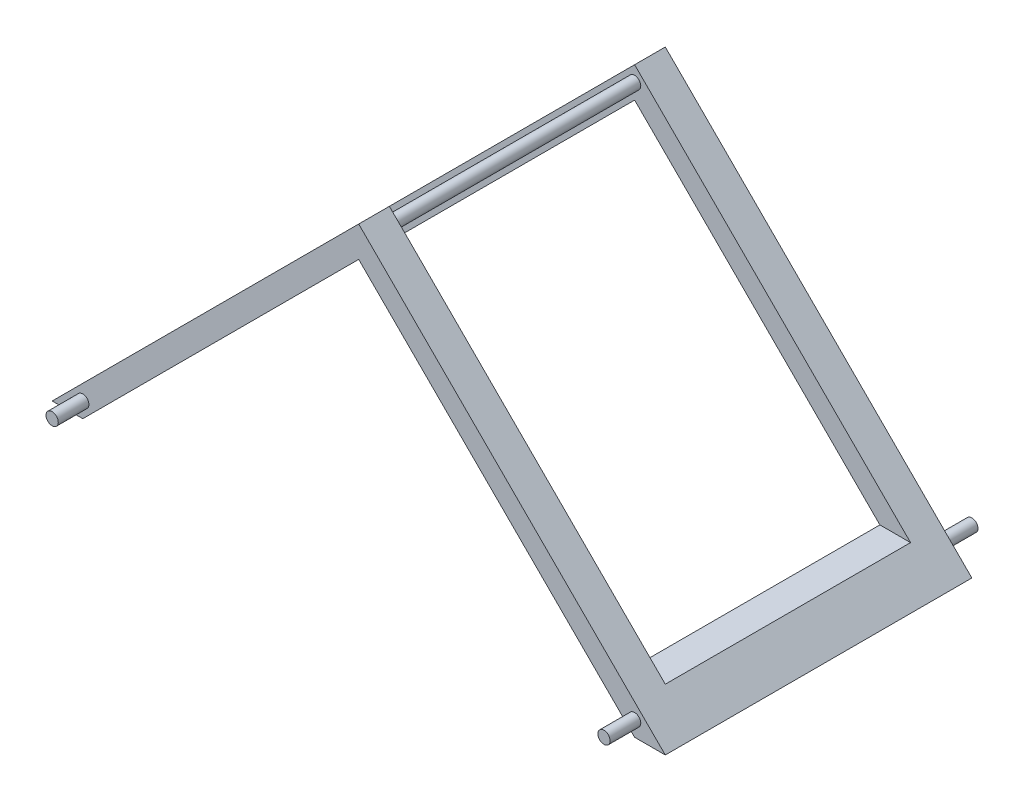
ISO-10303-21;
HEADER;
FILE_DESCRIPTION(('STEP AP214'),'2;1');
FILE_NAME('part.step','',(''),(''),'','','');
FILE_SCHEMA(('AUTOMOTIVE_DESIGN { 1 0 10303 214 1 1 1 1 }'));
ENDSEC;
DATA;
#1=APPLICATION_CONTEXT('core data for automotive mechanical design processes');
#2=APPLICATION_PROTOCOL_DEFINITION('international standard','automotive_design',2000,#1);
#3=PRODUCT_CONTEXT('',#1,'mechanical');
#4=PRODUCT('Part','Part','',(#3));
#5=PRODUCT_RELATED_PRODUCT_CATEGORY('part','',(#4));
#6=PRODUCT_DEFINITION_FORMATION('','',#4);
#7=PRODUCT_DEFINITION_CONTEXT('part definition',#1,'design');
#8=PRODUCT_DEFINITION('design','',#6,#7);
#9=PRODUCT_DEFINITION_SHAPE('','',#8);
#10=(LENGTH_UNIT() NAMED_UNIT(*) SI_UNIT(.MILLI.,.METRE.));
#11=(NAMED_UNIT(*) PLANE_ANGLE_UNIT() SI_UNIT($,.RADIAN.));
#12=(NAMED_UNIT(*) SI_UNIT($,.STERADIAN.) SOLID_ANGLE_UNIT());
#13=UNCERTAINTY_MEASURE_WITH_UNIT(LENGTH_MEASURE(1.E-05),#10,'distance_accuracy_value','');
#14=(GEOMETRIC_REPRESENTATION_CONTEXT(3) GLOBAL_UNCERTAINTY_ASSIGNED_CONTEXT((#13)) GLOBAL_UNIT_ASSIGNED_CONTEXT((#10,
#11,#12)) REPRESENTATION_CONTEXT('',''));
#15=CARTESIAN_POINT('',(0.,0.,0.));
#16=DIRECTION('',(0.,0.,1.));
#17=DIRECTION('',(1.,0.,0.));
#18=AXIS2_PLACEMENT_3D('',#15,#16,#17);
#19=CARTESIAN_POINT('',(-450.,0.,250.));
#20=DIRECTION('',(0.,-1.,0.));
#21=DIRECTION('',(1.,0.,0.));
#22=AXIS2_PLACEMENT_3D('',#19,#20,#21);
#23=PLANE('',#22);
#24=DIRECTION('',(-1.,0.,0.));
#25=VECTOR('',#24,1.);
#26=CARTESIAN_POINT('',(-450.,0.,-250.));
#27=LINE('',#26,#25);
#28=CARTESIAN_POINT('',(-450.,0.,-250.));
#29=VERTEX_POINT('',#28);
#30=CARTESIAN_POINT('',(-500.,0.,-250.));
#31=VERTEX_POINT('',#30);
#32=EDGE_CURVE('E169',#29,#31,#27,.T.);
#33=ORIENTED_EDGE('',*,*,#32,.F.);
#34=DIRECTION('',(0.,0.,-1.));
#35=VECTOR('',#34,1.);
#36=CARTESIAN_POINT('',(-450.,0.,250.));
#37=LINE('',#36,#35);
#38=CARTESIAN_POINT('',(-450.,0.,250.));
#39=VERTEX_POINT('',#38);
#40=EDGE_CURVE('E218',#39,#29,#37,.T.);
#41=ORIENTED_EDGE('',*,*,#40,.F.);
#42=DIRECTION('',(-1.,0.,0.));
#43=VECTOR('',#42,1.);
#44=CARTESIAN_POINT('',(-450.,0.,250.));
#45=LINE('',#44,#43);
#46=CARTESIAN_POINT('',(-500.,0.,250.));
#47=VERTEX_POINT('',#46);
#48=EDGE_CURVE('E170',#39,#47,#45,.T.);
#49=ORIENTED_EDGE('',*,*,#48,.T.);
#50=DIRECTION('',(0.,0.,-1.));
#51=VECTOR('',#50,1.);
#52=CARTESIAN_POINT('',(-500.,0.,250.));
#53=LINE('',#52,#51);
#54=EDGE_CURVE('E195',#47,#31,#53,.T.);
#55=ORIENTED_EDGE('',*,*,#54,.T.);
#56=EDGE_LOOP('',(#33,#41,#49,#55));
#57=FACE_BOUND('',#56,.T.);
#58=ADVANCED_FACE('F43',(#57),#23,.T.);
#59=CARTESIAN_POINT('',(0.,450.,250.));
#60=DIRECTION('',(0.707106781186548,-0.707106781186548,0.));
#61=DIRECTION('',(0.707106781186548,0.707106781186548,0.));
#62=AXIS2_PLACEMENT_3D('',#59,#60,#61);
#63=PLANE('',#62);
#64=DIRECTION('',(0.707106781186548,0.707106781186548,0.));
#65=VECTOR('',#64,1.);
#66=CARTESIAN_POINT('',(0.,450.,-200.));
#67=LINE('',#66,#65);
#68=CARTESIAN_POINT('',(-400.,50.0000000000001,-200.));
#69=VERTEX_POINT('',#68);
#70=CARTESIAN_POINT('',(0.,450.,-200.));
#71=VERTEX_POINT('',#70);
#72=EDGE_CURVE('E153',#69,#71,#67,.T.);
#73=ORIENTED_EDGE('',*,*,#72,.F.);
#74=DIRECTION('',(0.,0.,-1.));
#75=VECTOR('',#74,1.);
#76=CARTESIAN_POINT('',(-400.,50.,250.));
#77=LINE('',#76,#75);
#78=CARTESIAN_POINT('',(-400.,50.,200.));
#79=VERTEX_POINT('',#78);
#80=EDGE_CURVE('E142',#79,#69,#77,.T.);
#81=ORIENTED_EDGE('',*,*,#80,.F.);
#82=DIRECTION('',(-0.707106781186548,-0.707106781186548,0.));
#83=VECTOR('',#82,1.);
#84=CARTESIAN_POINT('',(0.,450.,200.));
#85=LINE('',#84,#83);
#86=CARTESIAN_POINT('',(0.,450.,200.));
#87=VERTEX_POINT('',#86);
#88=EDGE_CURVE('E129',#87,#79,#85,.T.);
#89=ORIENTED_EDGE('',*,*,#88,.F.);
#90=DIRECTION('',(0.,0.,-1.));
#91=VECTOR('',#90,1.);
#92=CARTESIAN_POINT('',(0.,450.,250.));
#93=LINE('',#92,#91);
#94=CARTESIAN_POINT('',(0.,450.,250.));
#95=VERTEX_POINT('',#94);
#96=EDGE_CURVE('E222',#95,#87,#93,.T.);
#97=ORIENTED_EDGE('',*,*,#96,.F.);
#98=DIRECTION('',(-0.707106781186548,-0.707106781186548,0.));
#99=VECTOR('',#98,1.);
#100=CARTESIAN_POINT('',(0.,450.,250.));
#101=LINE('',#100,#99);
#102=EDGE_CURVE('E191',#95,#39,#101,.T.);
#103=ORIENTED_EDGE('',*,*,#102,.T.);
#104=ORIENTED_EDGE('',*,*,#40,.T.);
#105=DIRECTION('',(-0.707106781186548,-0.707106781186548,0.));
#106=VECTOR('',#105,1.);
#107=CARTESIAN_POINT('',(0.,450.,-250.));
#108=LINE('',#107,#106);
#109=CARTESIAN_POINT('',(0.,450.,-250.));
#110=VERTEX_POINT('',#109);
#111=EDGE_CURVE('E175',#110,#29,#108,.T.);
#112=ORIENTED_EDGE('',*,*,#111,.F.);
#113=EDGE_CURVE('E225',#71,#110,#93,.T.);
#114=ORIENTED_EDGE('',*,*,#113,.F.);
#115=EDGE_LOOP('',(#73,#81,#89,#97,#103,#104,#112,#114));
#116=FACE_BOUND('',#115,.T.);
#117=ADVANCED_FACE('F151',(#116),#63,.T.);
#118=CARTESIAN_POINT('',(450.,0.,250.));
#119=DIRECTION('',(-0.707106781186548,-0.707106781186547,0.));
#120=DIRECTION('',(0.707106781186547,-0.707106781186548,0.));
#121=AXIS2_PLACEMENT_3D('',#118,#119,#120);
#122=PLANE('',#121);
#123=DIRECTION('',(0.707106781186547,-0.707106781186548,0.));
#124=VECTOR('',#123,1.);
#125=CARTESIAN_POINT('',(450.,0.,-200.));
#126=LINE('',#125,#124);
#127=CARTESIAN_POINT('',(400.,50.0000000000001,-200.));
#128=VERTEX_POINT('',#127);
#129=EDGE_CURVE('E160',#71,#128,#126,.T.);
#130=ORIENTED_EDGE('',*,*,#129,.F.);
#131=ORIENTED_EDGE('',*,*,#113,.T.);
#132=DIRECTION('',(-0.707106781186547,0.707106781186548,0.));
#133=VECTOR('',#132,1.);
#134=CARTESIAN_POINT('',(450.,0.,-250.));
#135=LINE('',#134,#133);
#136=CARTESIAN_POINT('',(450.,0.,-250.));
#137=VERTEX_POINT('',#136);
#138=EDGE_CURVE('E211',#137,#110,#135,.T.);
#139=ORIENTED_EDGE('',*,*,#138,.F.);
#140=DIRECTION('',(0.,0.,-1.));
#141=VECTOR('',#140,1.);
#142=CARTESIAN_POINT('',(450.,0.,250.));
#143=LINE('',#142,#141);
#144=CARTESIAN_POINT('',(450.,0.,250.));
#145=VERTEX_POINT('',#144);
#146=EDGE_CURVE('E226',#145,#137,#143,.T.);
#147=ORIENTED_EDGE('',*,*,#146,.F.);
#148=DIRECTION('',(-0.707106781186547,0.707106781186548,0.));
#149=VECTOR('',#148,1.);
#150=CARTESIAN_POINT('',(450.,0.,250.));
#151=LINE('',#150,#149);
#152=EDGE_CURVE('E187',#145,#95,#151,.T.);
#153=ORIENTED_EDGE('',*,*,#152,.T.);
#154=ORIENTED_EDGE('',*,*,#96,.T.);
#155=DIRECTION('',(-0.707106781186547,0.707106781186548,0.));
#156=VECTOR('',#155,1.);
#157=CARTESIAN_POINT('',(450.,0.,200.));
#158=LINE('',#157,#156);
#159=CARTESIAN_POINT('',(400.,50.0000000000001,200.));
#160=VERTEX_POINT('',#159);
#161=EDGE_CURVE('E132',#160,#87,#158,.T.);
#162=ORIENTED_EDGE('',*,*,#161,.F.);
#163=DIRECTION('',(0.,0.,1.));
#164=VECTOR('',#163,1.);
#165=CARTESIAN_POINT('',(400.,50.0000000000001,250.));
#166=LINE('',#165,#164);
#167=EDGE_CURVE('E156',#128,#160,#166,.T.);
#168=ORIENTED_EDGE('',*,*,#167,.F.);
#169=EDGE_LOOP('',(#130,#131,#139,#147,#153,#154,#162,#168));
#170=FACE_BOUND('',#169,.T.);
#171=ADVANCED_FACE('F276',(#170),#122,.T.);
#172=CARTESIAN_POINT('',(500.,0.,250.));
#173=DIRECTION('',(0.,-1.,0.));
#174=DIRECTION('',(1.,0.,0.));
#175=AXIS2_PLACEMENT_3D('',#172,#173,#174);
#176=PLANE('',#175);
#177=DIRECTION('',(-1.,0.,0.));
#178=VECTOR('',#177,1.);
#179=CARTESIAN_POINT('',(500.,0.,-250.));
#180=LINE('',#179,#178);
#181=CARTESIAN_POINT('',(500.,0.,-250.));
#182=VERTEX_POINT('',#181);
#183=EDGE_CURVE('E207',#182,#137,#180,.T.);
#184=ORIENTED_EDGE('',*,*,#183,.F.);
#185=DIRECTION('',(0.,0.,-1.));
#186=VECTOR('',#185,1.);
#187=CARTESIAN_POINT('',(500.,0.,250.));
#188=LINE('',#187,#186);
#189=CARTESIAN_POINT('',(500.,0.,250.));
#190=VERTEX_POINT('',#189);
#191=EDGE_CURVE('E229',#190,#182,#188,.T.);
#192=ORIENTED_EDGE('',*,*,#191,.F.);
#193=DIRECTION('',(-1.,0.,0.));
#194=VECTOR('',#193,1.);
#195=CARTESIAN_POINT('',(500.,0.,250.));
#196=LINE('',#195,#194);
#197=EDGE_CURVE('E183',#190,#145,#196,.T.);
#198=ORIENTED_EDGE('',*,*,#197,.T.);
#199=ORIENTED_EDGE('',*,*,#146,.T.);
#200=EDGE_LOOP('',(#184,#192,#198,#199));
#201=FACE_BOUND('',#200,.T.);
#202=ADVANCED_FACE('F281',(#201),#176,.T.);
#203=CARTESIAN_POINT('',(0.,500.,250.));
#204=DIRECTION('',(0.707106781186548,0.707106781186548,0.));
#205=DIRECTION('',(-0.707106781186548,0.707106781186548,0.));
#206=AXIS2_PLACEMENT_3D('',#203,#204,#205);
#207=PLANE('',#206);
#208=DIRECTION('',(-0.707106781186548,0.707106781186548,0.));
#209=VECTOR('',#208,1.);
#210=CARTESIAN_POINT('',(0.,500.,-200.));
#211=LINE('',#210,#209);
#212=CARTESIAN_POINT('',(450.,50.0000000000001,-200.));
#213=VERTEX_POINT('',#212);
#214=CARTESIAN_POINT('',(1.66533453693773E-13,500.,-200.));
#215=VERTEX_POINT('',#214);
#216=EDGE_CURVE('E155',#213,#215,#211,.T.);
#217=ORIENTED_EDGE('',*,*,#216,.F.);
#218=DIRECTION('',(0.,0.,-1.));
#219=VECTOR('',#218,1.);
#220=CARTESIAN_POINT('',(450.,50.0000000000001,250.));
#221=LINE('',#220,#219);
#222=CARTESIAN_POINT('',(450.,50.0000000000001,200.));
#223=VERTEX_POINT('',#222);
#224=EDGE_CURVE('E137',#223,#213,#221,.T.);
#225=ORIENTED_EDGE('',*,*,#224,.F.);
#226=DIRECTION('',(0.707106781186548,-0.707106781186548,0.));
#227=VECTOR('',#226,1.);
#228=CARTESIAN_POINT('',(0.,500.,200.));
#229=LINE('',#228,#227);
#230=CARTESIAN_POINT('',(1.66533453693773E-13,500.,200.));
#231=VERTEX_POINT('',#230);
#232=EDGE_CURVE('E305',#231,#223,#229,.T.);
#233=ORIENTED_EDGE('',*,*,#232,.F.);
#234=DIRECTION('',(0.,0.,-1.));
#235=VECTOR('',#234,1.);
#236=CARTESIAN_POINT('',(0.,500.,250.));
#237=LINE('',#236,#235);
#238=CARTESIAN_POINT('',(0.,500.,250.));
#239=VERTEX_POINT('',#238);
#240=EDGE_CURVE('E232',#239,#231,#237,.T.);
#241=ORIENTED_EDGE('',*,*,#240,.F.);
#242=DIRECTION('',(0.707106781186547,-0.707106781186547,0.));
#243=VECTOR('',#242,1.);
#244=CARTESIAN_POINT('',(0.,500.,250.));
#245=LINE('',#244,#243);
#246=EDGE_CURVE('E179',#239,#190,#245,.T.);
#247=ORIENTED_EDGE('',*,*,#246,.T.);
#248=ORIENTED_EDGE('',*,*,#191,.T.);
#249=DIRECTION('',(0.707106781186547,-0.707106781186547,0.));
#250=VECTOR('',#249,1.);
#251=CARTESIAN_POINT('',(0.,500.,-250.));
#252=LINE('',#251,#250);
#253=CARTESIAN_POINT('',(0.,500.,-250.));
#254=VERTEX_POINT('',#253);
#255=EDGE_CURVE('E203',#254,#182,#252,.T.);
#256=ORIENTED_EDGE('',*,*,#255,.F.);
#257=EDGE_CURVE('E236',#215,#254,#237,.T.);
#258=ORIENTED_EDGE('',*,*,#257,.F.);
#259=EDGE_LOOP('',(#217,#225,#233,#241,#247,#248,#256,#258));
#260=FACE_BOUND('',#259,.T.);
#261=ADVANCED_FACE('F285',(#260),#207,.T.);
#262=CARTESIAN_POINT('',(-500.,0.,250.));
#263=DIRECTION('',(-0.707106781186547,0.707106781186548,0.));
#264=DIRECTION('',(-0.707106781186548,-0.707106781186547,0.));
#265=AXIS2_PLACEMENT_3D('',#262,#263,#264);
#266=PLANE('',#265);
#267=DIRECTION('',(-0.707106781186548,-0.707106781186547,0.));
#268=VECTOR('',#267,1.);
#269=CARTESIAN_POINT('',(-500.,0.,-200.));
#270=LINE('',#269,#268);
#271=CARTESIAN_POINT('',(-450.,50.0000000000001,-200.));
#272=VERTEX_POINT('',#271);
#273=EDGE_CURVE('E243',#215,#272,#270,.T.);
#274=ORIENTED_EDGE('',*,*,#273,.F.);
#275=ORIENTED_EDGE('',*,*,#257,.T.);
#276=DIRECTION('',(0.707106781186548,0.707106781186547,0.));
#277=VECTOR('',#276,1.);
#278=CARTESIAN_POINT('',(-500.,0.,-250.));
#279=LINE('',#278,#277);
#280=EDGE_CURVE('E199',#31,#254,#279,.T.);
#281=ORIENTED_EDGE('',*,*,#280,.F.);
#282=ORIENTED_EDGE('',*,*,#54,.F.);
#283=DIRECTION('',(0.707106781186548,0.707106781186547,0.));
#284=VECTOR('',#283,1.);
#285=CARTESIAN_POINT('',(-500.,0.,250.));
#286=LINE('',#285,#284);
#287=EDGE_CURVE('E174',#47,#239,#286,.T.);
#288=ORIENTED_EDGE('',*,*,#287,.T.);
#289=ORIENTED_EDGE('',*,*,#240,.T.);
#290=DIRECTION('',(0.707106781186548,0.707106781186547,0.));
#291=VECTOR('',#290,1.);
#292=CARTESIAN_POINT('',(-500.,0.,200.));
#293=LINE('',#292,#291);
#294=CARTESIAN_POINT('',(-450.,50.0000000000001,200.));
#295=VERTEX_POINT('',#294);
#296=EDGE_CURVE('E221',#295,#231,#293,.T.);
#297=ORIENTED_EDGE('',*,*,#296,.F.);
#298=DIRECTION('',(0.,0.,1.));
#299=VECTOR('',#298,1.);
#300=CARTESIAN_POINT('',(-450.,50.0000000000001,250.));
#301=LINE('',#300,#299);
#302=EDGE_CURVE('E145',#272,#295,#301,.T.);
#303=ORIENTED_EDGE('',*,*,#302,.F.);
#304=EDGE_LOOP('',(#274,#275,#281,#282,#288,#289,#297,#303));
#305=FACE_BOUND('',#304,.T.);
#306=ADVANCED_FACE('F263',(#305),#266,.T.);
#307=CARTESIAN_POINT('',(0.,0.,250.));
#308=DIRECTION('',(0.,0.,-1.));
#309=DIRECTION('',(-1.,0.,0.));
#310=AXIS2_PLACEMENT_3D('',#307,#308,#309);
#311=PLANE('',#310);
#312=CARTESIAN_POINT('',(-450.,25.,250.));
#313=DIRECTION('',(0.,0.,-1.));
#314=DIRECTION('',(-1.,0.,0.));
#315=AXIS2_PLACEMENT_3D('',#312,#313,#314);
#316=CIRCLE('',#315,9.99999999999998);
#317=CARTESIAN_POINT('',(-460.,25.,250.));
#318=VERTEX_POINT('',#317);
#319=EDGE_CURVE('E545',#318,#318,#316,.T.);
#320=ORIENTED_EDGE('',*,*,#319,.T.);
#321=EDGE_LOOP('',(#320));
#322=FACE_BOUND('',#321,.T.);
#323=CARTESIAN_POINT('',(450.,25.,250.));
#324=DIRECTION('',(0.,0.,-1.));
#325=DIRECTION('',(-1.,0.,0.));
#326=AXIS2_PLACEMENT_3D('',#323,#324,#325);
#327=CIRCLE('',#326,9.99999999999998);
#328=CARTESIAN_POINT('',(440.,25.,250.));
#329=VERTEX_POINT('',#328);
#330=EDGE_CURVE('E51',#329,#329,#327,.F.);
#331=ORIENTED_EDGE('',*,*,#330,.F.);
#332=EDGE_LOOP('',(#331));
#333=FACE_BOUND('',#332,.T.);
#334=ORIENTED_EDGE('',*,*,#48,.F.);
#335=ORIENTED_EDGE('',*,*,#102,.F.);
#336=ORIENTED_EDGE('',*,*,#152,.F.);
#337=ORIENTED_EDGE('',*,*,#197,.F.);
#338=ORIENTED_EDGE('',*,*,#246,.F.);
#339=ORIENTED_EDGE('',*,*,#287,.F.);
#340=EDGE_LOOP('',(#334,#335,#336,#337,#338,#339));
#341=FACE_BOUND('',#340,.T.);
#342=ADVANCED_FACE('F259',(#322,#333,#341),#311,.F.);
#343=CARTESIAN_POINT('',(0.,0.,-250.));
#344=DIRECTION('',(0.,0.,-1.));
#345=DIRECTION('',(-1.,0.,0.));
#346=AXIS2_PLACEMENT_3D('',#343,#344,#345);
#347=PLANE('',#346);
#348=CARTESIAN_POINT('',(-450.,25.,-250.));
#349=DIRECTION('',(0.,0.,-1.));
#350=DIRECTION('',(-1.,0.,0.));
#351=AXIS2_PLACEMENT_3D('',#348,#349,#350);
#352=CIRCLE('',#351,9.99999999999998);
#353=CARTESIAN_POINT('',(-460.,25.,-250.));
#354=VERTEX_POINT('',#353);
#355=EDGE_CURVE('E546',#354,#354,#352,.T.);
#356=ORIENTED_EDGE('',*,*,#355,.F.);
#357=EDGE_LOOP('',(#356));
#358=FACE_BOUND('',#357,.T.);
#359=CARTESIAN_POINT('',(450.,25.,-250.));
#360=DIRECTION('',(0.,0.,-1.));
#361=DIRECTION('',(-1.,0.,0.));
#362=AXIS2_PLACEMENT_3D('',#359,#360,#361);
#363=CIRCLE('',#362,9.99999999999998);
#364=CARTESIAN_POINT('',(440.,25.,-250.));
#365=VERTEX_POINT('',#364);
#366=EDGE_CURVE('E11',#365,#365,#363,.T.);
#367=ORIENTED_EDGE('',*,*,#366,.F.);
#368=EDGE_LOOP('',(#367));
#369=FACE_BOUND('',#368,.T.);
#370=ORIENTED_EDGE('',*,*,#32,.T.);
#371=ORIENTED_EDGE('',*,*,#280,.T.);
#372=ORIENTED_EDGE('',*,*,#255,.T.);
#373=ORIENTED_EDGE('',*,*,#183,.T.);
#374=ORIENTED_EDGE('',*,*,#138,.T.);
#375=ORIENTED_EDGE('',*,*,#111,.T.);
#376=EDGE_LOOP('',(#370,#371,#372,#373,#374,#375));
#377=FACE_BOUND('',#376,.T.);
#378=ADVANCED_FACE('F262',(#358,#369,#377),#347,.T.);
#379=CARTESIAN_POINT('',(-500.,50.0000000000001,200.));
#380=DIRECTION('',(0.,-1.,0.));
#381=DIRECTION('',(0.,0.,-1.));
#382=AXIS2_PLACEMENT_3D('',#379,#380,#381);
#383=PLANE('',#382);
#384=ORIENTED_EDGE('',*,*,#80,.T.);
#385=DIRECTION('',(1.,0.,0.));
#386=VECTOR('',#385,1.);
#387=CARTESIAN_POINT('',(-500.,50.0000000000001,-200.));
#388=LINE('',#387,#386);
#389=EDGE_CURVE('E302',#272,#69,#388,.T.);
#390=ORIENTED_EDGE('',*,*,#389,.F.);
#391=ORIENTED_EDGE('',*,*,#302,.T.);
#392=DIRECTION('',(1.,0.,0.));
#393=VECTOR('',#392,1.);
#394=CARTESIAN_POINT('',(-500.,50.0000000000001,200.));
#395=LINE('',#394,#393);
#396=EDGE_CURVE('E65',#295,#79,#395,.T.);
#397=ORIENTED_EDGE('',*,*,#396,.T.);
#398=EDGE_LOOP('',(#384,#390,#391,#397));
#399=FACE_BOUND('',#398,.T.);
#400=ADVANCED_FACE('F140',(#399),#383,.F.);
#401=CARTESIAN_POINT('',(-500.,50.0000000000001,-200.));
#402=DIRECTION('',(0.,0.,-1.));
#403=DIRECTION('',(-1.,0.,0.));
#404=AXIS2_PLACEMENT_3D('',#401,#402,#403);
#405=PLANE('',#404);
#406=CARTESIAN_POINT('',(0.,475.,-200.));
#407=DIRECTION('',(0.,0.,-1.));
#408=DIRECTION('',(-1.,0.,0.));
#409=AXIS2_PLACEMENT_3D('',#406,#407,#408);
#410=CIRCLE('',#409,9.99999999999999);
#411=CARTESIAN_POINT('',(-9.99999999999999,475.,-200.));
#412=VERTEX_POINT('',#411);
#413=EDGE_CURVE('E250',#412,#412,#410,.F.);
#414=ORIENTED_EDGE('',*,*,#413,.F.);
#415=EDGE_LOOP('',(#414));
#416=FACE_BOUND('',#415,.T.);
#417=ORIENTED_EDGE('',*,*,#72,.T.);
#418=ORIENTED_EDGE('',*,*,#129,.T.);
#419=EDGE_CURVE('E148',#128,#213,#388,.T.);
#420=ORIENTED_EDGE('',*,*,#419,.T.);
#421=ORIENTED_EDGE('',*,*,#216,.T.);
#422=ORIENTED_EDGE('',*,*,#273,.T.);
#423=ORIENTED_EDGE('',*,*,#389,.T.);
#424=EDGE_LOOP('',(#417,#418,#420,#421,#422,#423));
#425=FACE_BOUND('',#424,.T.);
#426=ADVANCED_FACE('F297',(#416,#425),#405,.F.);
#427=ORIENTED_EDGE('',*,*,#167,.T.);
#428=EDGE_CURVE('E58',#160,#223,#395,.T.);
#429=ORIENTED_EDGE('',*,*,#428,.T.);
#430=ORIENTED_EDGE('',*,*,#224,.T.);
#431=ORIENTED_EDGE('',*,*,#419,.F.);
#432=EDGE_LOOP('',(#427,#429,#430,#431));
#433=FACE_BOUND('',#432,.T.);
#434=ADVANCED_FACE('F315',(#433),#383,.F.);
#435=CARTESIAN_POINT('',(-500.,500.,200.));
#436=DIRECTION('',(0.,0.,1.));
#437=DIRECTION('',(0.,-1.,0.));
#438=AXIS2_PLACEMENT_3D('',#435,#436,#437);
#439=PLANE('',#438);
#440=CARTESIAN_POINT('',(0.,475.,200.));
#441=DIRECTION('',(0.,0.,1.));
#442=DIRECTION('',(0.,-1.,0.));
#443=AXIS2_PLACEMENT_3D('',#440,#441,#442);
#444=CIRCLE('',#443,9.99999999999999);
#445=CARTESIAN_POINT('',(0.,465.,200.));
#446=VERTEX_POINT('',#445);
#447=EDGE_CURVE('E246',#446,#446,#444,.F.);
#448=ORIENTED_EDGE('',*,*,#447,.F.);
#449=EDGE_LOOP('',(#448));
#450=FACE_BOUND('',#449,.T.);
#451=ORIENTED_EDGE('',*,*,#88,.T.);
#452=ORIENTED_EDGE('',*,*,#396,.F.);
#453=ORIENTED_EDGE('',*,*,#296,.T.);
#454=ORIENTED_EDGE('',*,*,#232,.T.);
#455=ORIENTED_EDGE('',*,*,#428,.F.);
#456=ORIENTED_EDGE('',*,*,#161,.T.);
#457=EDGE_LOOP('',(#451,#452,#453,#454,#455,#456));
#458=FACE_BOUND('',#457,.T.);
#459=ADVANCED_FACE('F130',(#450,#458),#439,.F.);
#460=CARTESIAN_POINT('',(0.,475.,-250.002));
#461=DIRECTION('',(0.,0.,1.));
#462=DIRECTION('',(0.,-1.,0.));
#463=AXIS2_PLACEMENT_3D('',#460,#461,#462);
#464=CYLINDRICAL_SURFACE('',#463,9.99999999999999);
#465=ORIENTED_EDGE('',*,*,#447,.T.);
#466=EDGE_LOOP('',(#465));
#467=FACE_BOUND('',#466,.T.);
#468=ORIENTED_EDGE('',*,*,#413,.T.);
#469=EDGE_LOOP('',(#468));
#470=FACE_BOUND('',#469,.T.);
#471=ADVANCED_FACE('F322',(#467,#470),#464,.T.);
#472=CARTESIAN_POINT('',(450.,25.,300.));
#473=DIRECTION('',(0.,0.,-1.));
#474=DIRECTION('',(-1.,0.,0.));
#475=AXIS2_PLACEMENT_3D('',#472,#473,#474);
#476=CYLINDRICAL_SURFACE('',#475,9.99999999999998);
#477=CARTESIAN_POINT('',(450.,25.,300.));
#478=DIRECTION('',(0.,0.,1.));
#479=DIRECTION('',(1.,0.,0.));
#480=AXIS2_PLACEMENT_3D('',#477,#478,#479);
#481=CIRCLE('',#480,9.99999999999998);
#482=CARTESIAN_POINT('',(460.,25.,300.));
#483=VERTEX_POINT('',#482);
#484=EDGE_CURVE('E307',#483,#483,#481,.T.);
#485=ORIENTED_EDGE('',*,*,#484,.F.);
#486=EDGE_LOOP('',(#485));
#487=FACE_BOUND('',#486,.T.);
#488=ORIENTED_EDGE('',*,*,#330,.T.);
#489=EDGE_LOOP('',(#488));
#490=FACE_BOUND('',#489,.T.);
#491=ADVANCED_FACE('F257',(#487,#490),#476,.T.);
#492=CARTESIAN_POINT('',(450.,25.,300.));
#493=DIRECTION('',(0.,0.,1.));
#494=DIRECTION('',(1.,0.,0.));
#495=AXIS2_PLACEMENT_3D('',#492,#493,#494);
#496=PLANE('',#495);
#497=ORIENTED_EDGE('',*,*,#484,.T.);
#498=EDGE_LOOP('',(#497));
#499=FACE_BOUND('',#498,.T.);
#500=ADVANCED_FACE('F396',(#499),#496,.T.);
#501=CARTESIAN_POINT('',(450.,25.,-300.));
#502=DIRECTION('',(0.,0.,1.));
#503=DIRECTION('',(1.,0.,0.));
#504=AXIS2_PLACEMENT_3D('',#501,#502,#503);
#505=CYLINDRICAL_SURFACE('',#504,9.99999999999998);
#506=CARTESIAN_POINT('',(450.,25.,-300.));
#507=DIRECTION('',(0.,0.,1.));
#508=DIRECTION('',(1.,0.,0.));
#509=AXIS2_PLACEMENT_3D('',#506,#507,#508);
#510=CIRCLE('',#509,9.99999999999998);
#511=CARTESIAN_POINT('',(460.,25.,-300.));
#512=VERTEX_POINT('',#511);
#513=EDGE_CURVE('E558',#512,#512,#510,.T.);
#514=ORIENTED_EDGE('',*,*,#513,.T.);
#515=EDGE_LOOP('',(#514));
#516=FACE_BOUND('',#515,.T.);
#517=ORIENTED_EDGE('',*,*,#366,.T.);
#518=EDGE_LOOP('',(#517));
#519=FACE_BOUND('',#518,.T.);
#520=ADVANCED_FACE('F407',(#516,#519),#505,.T.);
#521=CARTESIAN_POINT('',(450.,25.,-300.));
#522=DIRECTION('',(0.,0.,-1.));
#523=DIRECTION('',(1.,0.,0.));
#524=AXIS2_PLACEMENT_3D('',#521,#522,#523);
#525=PLANE('',#524);
#526=ORIENTED_EDGE('',*,*,#513,.F.);
#527=EDGE_LOOP('',(#526));
#528=FACE_BOUND('',#527,.T.);
#529=ADVANCED_FACE('F417',(#528),#525,.T.);
#530=CARTESIAN_POINT('',(-450.,25.,300.));
#531=DIRECTION('',(0.,0.,-1.));
#532=DIRECTION('',(-1.,0.,0.));
#533=AXIS2_PLACEMENT_3D('',#530,#531,#532);
#534=CYLINDRICAL_SURFACE('',#533,9.99999999999998);
#535=CARTESIAN_POINT('',(-450.,25.,300.));
#536=DIRECTION('',(0.,0.,-1.));
#537=DIRECTION('',(-1.,0.,0.));
#538=AXIS2_PLACEMENT_3D('',#535,#536,#537);
#539=CIRCLE('',#538,9.99999999999998);
#540=CARTESIAN_POINT('',(-460.,25.,300.));
#541=VERTEX_POINT('',#540);
#542=EDGE_CURVE('E551',#541,#541,#539,.T.);
#543=ORIENTED_EDGE('',*,*,#542,.T.);
#544=EDGE_LOOP('',(#543));
#545=FACE_BOUND('',#544,.T.);
#546=ORIENTED_EDGE('',*,*,#319,.F.);
#547=EDGE_LOOP('',(#546));
#548=FACE_BOUND('',#547,.T.);
#549=ADVANCED_FACE('F427',(#545,#548),#534,.T.);
#550=CARTESIAN_POINT('',(-450.,25.,300.));
#551=DIRECTION('',(0.,0.,1.));
#552=DIRECTION('',(-1.,0.,0.));
#553=AXIS2_PLACEMENT_3D('',#550,#551,#552);
#554=PLANE('',#553);
#555=ORIENTED_EDGE('',*,*,#542,.F.);
#556=EDGE_LOOP('',(#555));
#557=FACE_BOUND('',#556,.T.);
#558=ADVANCED_FACE('F438',(#557),#554,.T.);
#559=CARTESIAN_POINT('',(-450.,25.,-300.));
#560=DIRECTION('',(0.,0.,1.));
#561=DIRECTION('',(1.,0.,0.));
#562=AXIS2_PLACEMENT_3D('',#559,#560,#561);
#563=CYLINDRICAL_SURFACE('',#562,9.99999999999998);
#564=CARTESIAN_POINT('',(-450.,25.,-300.));
#565=DIRECTION('',(0.,0.,-1.));
#566=DIRECTION('',(-1.,0.,0.));
#567=AXIS2_PLACEMENT_3D('',#564,#565,#566);
#568=CIRCLE('',#567,9.99999999999998);
#569=CARTESIAN_POINT('',(-460.,25.,-300.));
#570=VERTEX_POINT('',#569);
#571=EDGE_CURVE('E543',#570,#570,#568,.T.);
#572=ORIENTED_EDGE('',*,*,#571,.F.);
#573=EDGE_LOOP('',(#572));
#574=FACE_BOUND('',#573,.T.);
#575=ORIENTED_EDGE('',*,*,#355,.T.);
#576=EDGE_LOOP('',(#575));
#577=FACE_BOUND('',#576,.T.);
#578=ADVANCED_FACE('F445',(#574,#577),#563,.T.);
#579=CARTESIAN_POINT('',(-450.,25.,-300.));
#580=DIRECTION('',(0.,0.,-1.));
#581=DIRECTION('',(-1.,0.,0.));
#582=AXIS2_PLACEMENT_3D('',#579,#580,#581);
#583=PLANE('',#582);
#584=ORIENTED_EDGE('',*,*,#571,.T.);
#585=EDGE_LOOP('',(#584));
#586=FACE_BOUND('',#585,.T.);
#587=ADVANCED_FACE('F453',(#586),#583,.T.);
#588=CLOSED_SHELL('',(#58,#117,#171,#202,#261,#306,#342,#378,#400,#426,#434,#459,#471,#491,#500,
#520,#529,#549,#558,#578,#587));
#589=MANIFOLD_SOLID_BREP('B2',#588);
#590=ADVANCED_BREP_SHAPE_REPRESENTATION('',(#18,#589),#14);
#591=SHAPE_DEFINITION_REPRESENTATION(#9,#590);
ENDSEC;
END-ISO-10303-21;
